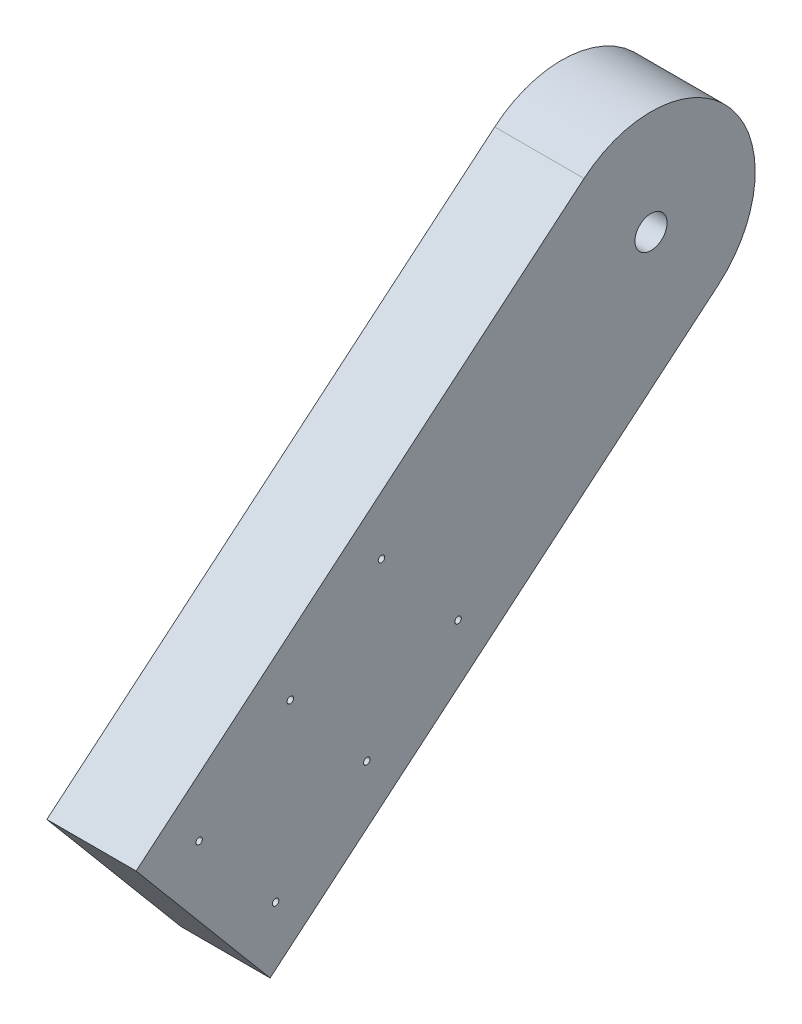
ISO-10303-21;
HEADER;
FILE_DESCRIPTION(('STEP AP214'),'2;1');
FILE_NAME('part.step','',(''),(''),'','','');
FILE_SCHEMA(('AUTOMOTIVE_DESIGN { 1 0 10303 214 1 1 1 1 }'));
ENDSEC;
DATA;
#1=APPLICATION_CONTEXT('core data for automotive mechanical design processes');
#2=APPLICATION_PROTOCOL_DEFINITION('international standard','automotive_design',2000,#1);
#3=PRODUCT_CONTEXT('',#1,'mechanical');
#4=PRODUCT('Part','Part','',(#3));
#5=PRODUCT_RELATED_PRODUCT_CATEGORY('part','',(#4));
#6=PRODUCT_DEFINITION_FORMATION('','',#4);
#7=PRODUCT_DEFINITION_CONTEXT('part definition',#1,'design');
#8=PRODUCT_DEFINITION('design','',#6,#7);
#9=PRODUCT_DEFINITION_SHAPE('','',#8);
#10=(LENGTH_UNIT() NAMED_UNIT(*) SI_UNIT(.MILLI.,.METRE.));
#11=(NAMED_UNIT(*) PLANE_ANGLE_UNIT() SI_UNIT($,.RADIAN.));
#12=(NAMED_UNIT(*) SI_UNIT($,.STERADIAN.) SOLID_ANGLE_UNIT());
#13=UNCERTAINTY_MEASURE_WITH_UNIT(LENGTH_MEASURE(1.E-05),#10,'distance_accuracy_value','');
#14=(GEOMETRIC_REPRESENTATION_CONTEXT(3) GLOBAL_UNCERTAINTY_ASSIGNED_CONTEXT((#13)) GLOBAL_UNIT_ASSIGNED_CONTEXT((#10,
#11,#12)) REPRESENTATION_CONTEXT('',''));
#15=CARTESIAN_POINT('',(0.,0.,0.));
#16=DIRECTION('',(0.,0.,1.));
#17=DIRECTION('',(1.,0.,0.));
#18=AXIS2_PLACEMENT_3D('',#15,#16,#17);
#19=CARTESIAN_POINT('',(95.3770000000001,-243.895191640802,695.878289417359));
#20=DIRECTION('',(-1.,0.,0.));
#21=DIRECTION('',(0.,-1.,0.));
#22=AXIS2_PLACEMENT_3D('',#19,#20,#21);
#23=PLANE('',#22);
#24=CARTESIAN_POINT('',(95.3770000000001,-346.129623296237,778.201155427296));
#25=DIRECTION('',(-1.,0.,0.));
#26=DIRECTION('',(0.,-1.,0.));
#27=AXIS2_PLACEMENT_3D('',#24,#25,#26);
#28=CIRCLE('',#27,1.3890625000001);
#29=CARTESIAN_POINT('',(95.3770000000001,-347.518685796237,778.201155427296));
#30=VERTEX_POINT('',#29);
#31=EDGE_CURVE('E189',#30,#30,#28,.T.);
#32=ORIENTED_EDGE('',*,*,#31,.T.);
#33=EDGE_LOOP('',(#32));
#34=FACE_BOUND('',#33,.T.);
#35=CARTESIAN_POINT('',(95.3770000000001,-378.783233868313,817.116213137741));
#36=DIRECTION('',(-1.,0.,0.));
#37=DIRECTION('',(0.,-1.,0.));
#38=AXIS2_PLACEMENT_3D('',#35,#36,#37);
#39=CIRCLE('',#38,1.3890625000001);
#40=CARTESIAN_POINT('',(95.3770000000001,-380.172296368313,817.116213137741));
#41=VERTEX_POINT('',#40);
#42=EDGE_CURVE('E183',#41,#41,#39,.T.);
#43=ORIENTED_EDGE('',*,*,#42,.T.);
#44=EDGE_LOOP('',(#43));
#45=FACE_BOUND('',#44,.T.);
#46=CARTESIAN_POINT('',(95.3770000000001,-411.43684444039,856.031270848185));
#47=DIRECTION('',(-1.,0.,0.));
#48=DIRECTION('',(0.,-1.,0.));
#49=AXIS2_PLACEMENT_3D('',#46,#47,#48);
#50=CIRCLE('',#49,1.3890625000001);
#51=CARTESIAN_POINT('',(95.3770000000001,-412.82590694039,856.031270848185));
#52=VERTEX_POINT('',#51);
#53=EDGE_CURVE('E177',#52,#52,#50,.T.);
#54=ORIENTED_EDGE('',*,*,#53,.T.);
#55=EDGE_LOOP('',(#54));
#56=FACE_BOUND('',#55,.T.);
#57=CARTESIAN_POINT('',(95.3770000000001,-372.521786729946,888.684881420261));
#58=DIRECTION('',(-1.,0.,0.));
#59=DIRECTION('',(0.,-1.,0.));
#60=AXIS2_PLACEMENT_3D('',#57,#58,#59);
#61=CIRCLE('',#60,1.3890625000001);
#62=CARTESIAN_POINT('',(95.3770000000001,-373.910849229946,888.684881420261));
#63=VERTEX_POINT('',#62);
#64=EDGE_CURVE('E171',#63,#63,#61,.T.);
#65=ORIENTED_EDGE('',*,*,#64,.T.);
#66=EDGE_LOOP('',(#65));
#67=FACE_BOUND('',#66,.T.);
#68=CARTESIAN_POINT('',(95.3770000000001,-339.86817615787,849.769823709817));
#69=DIRECTION('',(-1.,0.,0.));
#70=DIRECTION('',(0.,-1.,0.));
#71=AXIS2_PLACEMENT_3D('',#68,#69,#70);
#72=CIRCLE('',#71,1.3890625000001);
#73=CARTESIAN_POINT('',(95.3770000000001,-341.25723865787,849.769823709817));
#74=VERTEX_POINT('',#73);
#75=EDGE_CURVE('E165',#74,#74,#72,.T.);
#76=ORIENTED_EDGE('',*,*,#75,.T.);
#77=EDGE_LOOP('',(#76));
#78=FACE_BOUND('',#77,.T.);
#79=CARTESIAN_POINT('',(95.3770000000001,-307.214565585793,810.854765999373));
#80=DIRECTION('',(-1.,0.,0.));
#81=DIRECTION('',(0.,-1.,0.));
#82=AXIS2_PLACEMENT_3D('',#79,#80,#81);
#83=CIRCLE('',#82,1.3890625000001);
#84=CARTESIAN_POINT('',(95.3770000000001,-308.603628085793,810.854765999373));
#85=VERTEX_POINT('',#84);
#86=EDGE_CURVE('E159',#85,#85,#83,.T.);
#87=ORIENTED_EDGE('',*,*,#86,.T.);
#88=EDGE_LOOP('',(#87));
#89=FACE_BOUND('',#88,.T.);
#90=DIRECTION('',(0.,-0.766044443118977,-0.642787609686541));
#91=VECTOR('',#90,1.);
#92=CARTESIAN_POINT('',(95.3770000000001,-438.275095046335,858.379313525072));
#93=LINE('',#92,#91);
#94=CARTESIAN_POINT('',(95.3770000000001,-370.173744053058,915.523132026206));
#95=VERTEX_POINT('',#94);
#96=CARTESIAN_POINT('',(95.3770000000001,-438.275095046335,858.379313525072));
#97=VERTEX_POINT('',#96);
#98=EDGE_CURVE('E88',#95,#97,#93,.T.);
#99=ORIENTED_EDGE('',*,*,#98,.T.);
#100=DIRECTION('',(0.,0.642787609686541,-0.766044443118977));
#101=VECTOR('',#100,1.);
#102=CARTESIAN_POINT('',(95.3770000000001,-277.94586713744,667.306380166792));
#103=LINE('',#102,#101);
#104=CARTESIAN_POINT('',(95.3770000000001,-277.94586713744,667.306380166792));
#105=VERTEX_POINT('',#104);
#106=EDGE_CURVE('E83',#97,#105,#103,.T.);
#107=ORIENTED_EDGE('',*,*,#106,.T.);
#108=CARTESIAN_POINT('',(95.3770000000001,-243.895191640802,695.878289417359));
#109=DIRECTION('',(1.,0.,0.));
#110=DIRECTION('',(0.,-1.,0.));
#111=AXIS2_PLACEMENT_3D('',#108,#109,#110);
#112=CIRCLE('',#111,44.4499999999999);
#113=CARTESIAN_POINT('',(95.377,-209.844516144163,724.450198667926));
#114=VERTEX_POINT('',#113);
#115=EDGE_CURVE('E86',#105,#114,#112,.T.);
#116=ORIENTED_EDGE('',*,*,#115,.T.);
#117=DIRECTION('',(0.,-0.64278760968654,0.766044443118977));
#118=VECTOR('',#117,1.);
#119=CARTESIAN_POINT('',(95.3770000000001,-370.173744053058,915.523132026206));
#120=LINE('',#119,#118);
#121=EDGE_CURVE('E53',#114,#95,#120,.T.);
#122=ORIENTED_EDGE('',*,*,#121,.T.);
#123=EDGE_LOOP('',(#99,#107,#116,#122));
#124=FACE_BOUND('',#123,.T.);
#125=CARTESIAN_POINT('',(95.3770000000001,-243.895191640802,695.878289417359));
#126=DIRECTION('',(1.,0.,0.));
#127=DIRECTION('',(0.,1.,0.));
#128=AXIS2_PLACEMENT_3D('',#125,#126,#127);
#129=CIRCLE('',#128,6.84999999999996);
#130=CARTESIAN_POINT('',(95.3770000000001,-250.745191640802,695.878289417359));
#131=VERTEX_POINT('',#130);
#132=EDGE_CURVE('E103',#131,#131,#129,.T.);
#133=ORIENTED_EDGE('',*,*,#132,.F.);
#134=EDGE_LOOP('',(#133));
#135=FACE_BOUND('',#134,.T.);
#136=ADVANCED_FACE('F36',(#34,#45,#56,#67,#78,#89,#124,#135),#23,.F.);
#137=CARTESIAN_POINT('',(57.2770000000001,-243.895191640802,695.878289417359));
#138=DIRECTION('',(-1.,0.,0.));
#139=DIRECTION('',(0.,-1.,0.));
#140=AXIS2_PLACEMENT_3D('',#137,#138,#139);
#141=PLANE('',#140);
#142=CARTESIAN_POINT('',(57.2770000000001,-307.214565585793,810.854765999373));
#143=DIRECTION('',(-1.,0.,0.));
#144=DIRECTION('',(0.,-1.,0.));
#145=AXIS2_PLACEMENT_3D('',#142,#143,#144);
#146=CIRCLE('',#145,1.3890625000001);
#147=CARTESIAN_POINT('',(57.2770000000001,-308.603628085793,810.854765999373));
#148=VERTEX_POINT('',#147);
#149=EDGE_CURVE('E152',#148,#148,#146,.T.);
#150=ORIENTED_EDGE('',*,*,#149,.F.);
#151=EDGE_LOOP('',(#150));
#152=FACE_BOUND('',#151,.T.);
#153=CARTESIAN_POINT('',(57.2770000000001,-346.129623296237,778.201155427296));
#154=DIRECTION('',(-1.,0.,0.));
#155=DIRECTION('',(0.,-1.,0.));
#156=AXIS2_PLACEMENT_3D('',#153,#154,#155);
#157=CIRCLE('',#156,1.3890625000001);
#158=CARTESIAN_POINT('',(57.2770000000001,-347.518685796237,778.201155427296));
#159=VERTEX_POINT('',#158);
#160=EDGE_CURVE('E146',#159,#159,#157,.T.);
#161=ORIENTED_EDGE('',*,*,#160,.F.);
#162=EDGE_LOOP('',(#161));
#163=FACE_BOUND('',#162,.T.);
#164=CARTESIAN_POINT('',(57.2770000000001,-378.783233868313,817.116213137741));
#165=DIRECTION('',(-1.,0.,0.));
#166=DIRECTION('',(0.,-1.,0.));
#167=AXIS2_PLACEMENT_3D('',#164,#165,#166);
#168=CIRCLE('',#167,1.3890625000001);
#169=CARTESIAN_POINT('',(57.2770000000001,-380.172296368313,817.116213137741));
#170=VERTEX_POINT('',#169);
#171=EDGE_CURVE('E140',#170,#170,#168,.T.);
#172=ORIENTED_EDGE('',*,*,#171,.F.);
#173=EDGE_LOOP('',(#172));
#174=FACE_BOUND('',#173,.T.);
#175=CARTESIAN_POINT('',(57.2770000000001,-411.43684444039,856.031270848185));
#176=DIRECTION('',(-1.,0.,0.));
#177=DIRECTION('',(0.,-1.,0.));
#178=AXIS2_PLACEMENT_3D('',#175,#176,#177);
#179=CIRCLE('',#178,1.3890625000001);
#180=CARTESIAN_POINT('',(57.2770000000001,-412.82590694039,856.031270848185));
#181=VERTEX_POINT('',#180);
#182=EDGE_CURVE('E134',#181,#181,#179,.T.);
#183=ORIENTED_EDGE('',*,*,#182,.F.);
#184=EDGE_LOOP('',(#183));
#185=FACE_BOUND('',#184,.T.);
#186=CARTESIAN_POINT('',(57.2770000000001,-372.521786729946,888.684881420261));
#187=DIRECTION('',(-1.,0.,0.));
#188=DIRECTION('',(0.,-1.,0.));
#189=AXIS2_PLACEMENT_3D('',#186,#187,#188);
#190=CIRCLE('',#189,1.3890625000001);
#191=CARTESIAN_POINT('',(57.2770000000001,-373.910849229946,888.684881420261));
#192=VERTEX_POINT('',#191);
#193=EDGE_CURVE('E128',#192,#192,#190,.T.);
#194=ORIENTED_EDGE('',*,*,#193,.F.);
#195=EDGE_LOOP('',(#194));
#196=FACE_BOUND('',#195,.T.);
#197=CARTESIAN_POINT('',(57.2770000000001,-339.86817615787,849.769823709817));
#198=DIRECTION('',(-1.,0.,0.));
#199=DIRECTION('',(0.,-1.,0.));
#200=AXIS2_PLACEMENT_3D('',#197,#198,#199);
#201=CIRCLE('',#200,1.3890625000001);
#202=CARTESIAN_POINT('',(57.2770000000001,-341.25723865787,849.769823709817));
#203=VERTEX_POINT('',#202);
#204=EDGE_CURVE('E121',#203,#203,#201,.T.);
#205=ORIENTED_EDGE('',*,*,#204,.F.);
#206=EDGE_LOOP('',(#205));
#207=FACE_BOUND('',#206,.T.);
#208=DIRECTION('',(0.,-0.766044443118977,-0.642787609686541));
#209=VECTOR('',#208,1.);
#210=CARTESIAN_POINT('',(57.2770000000001,-438.275095046335,858.379313525072));
#211=LINE('',#210,#209);
#212=CARTESIAN_POINT('',(57.2770000000001,-370.173744053058,915.523132026206));
#213=VERTEX_POINT('',#212);
#214=CARTESIAN_POINT('',(57.2770000000001,-438.275095046335,858.379313525072));
#215=VERTEX_POINT('',#214);
#216=EDGE_CURVE('E100',#213,#215,#211,.T.);
#217=ORIENTED_EDGE('',*,*,#216,.F.);
#218=DIRECTION('',(0.,-0.64278760968654,0.766044443118977));
#219=VECTOR('',#218,1.);
#220=CARTESIAN_POINT('',(57.2770000000001,-370.173744053058,915.523132026206));
#221=LINE('',#220,#219);
#222=CARTESIAN_POINT('',(57.2770000000001,-209.844516144163,724.450198667926));
#223=VERTEX_POINT('',#222);
#224=EDGE_CURVE('E76',#223,#213,#221,.T.);
#225=ORIENTED_EDGE('',*,*,#224,.F.);
#226=CARTESIAN_POINT('',(57.2770000000001,-243.895191640802,695.878289417359));
#227=DIRECTION('',(1.,0.,0.));
#228=DIRECTION('',(0.,-1.,0.));
#229=AXIS2_PLACEMENT_3D('',#226,#227,#228);
#230=CIRCLE('',#229,44.4499999999999);
#231=CARTESIAN_POINT('',(57.2770000000001,-277.94586713744,667.306380166792));
#232=VERTEX_POINT('',#231);
#233=EDGE_CURVE('E70',#232,#223,#230,.T.);
#234=ORIENTED_EDGE('',*,*,#233,.F.);
#235=DIRECTION('',(0.,0.642787609686541,-0.766044443118977));
#236=VECTOR('',#235,1.);
#237=CARTESIAN_POINT('',(57.2770000000001,-277.94586713744,667.306380166792));
#238=LINE('',#237,#236);
#239=EDGE_CURVE('E92',#215,#232,#238,.T.);
#240=ORIENTED_EDGE('',*,*,#239,.F.);
#241=EDGE_LOOP('',(#217,#225,#234,#240));
#242=FACE_BOUND('',#241,.T.);
#243=CARTESIAN_POINT('',(57.2770000000001,-243.895191640802,695.878289417359));
#244=DIRECTION('',(1.,0.,0.));
#245=DIRECTION('',(0.,1.,0.));
#246=AXIS2_PLACEMENT_3D('',#243,#244,#245);
#247=CIRCLE('',#246,6.84999999999996);
#248=CARTESIAN_POINT('',(57.2770000000001,-250.745191640802,695.878289417359));
#249=VERTEX_POINT('',#248);
#250=EDGE_CURVE('E115',#249,#249,#247,.T.);
#251=ORIENTED_EDGE('',*,*,#250,.T.);
#252=EDGE_LOOP('',(#251));
#253=FACE_BOUND('',#252,.T.);
#254=ADVANCED_FACE('F111',(#152,#163,#174,#185,#196,#207,#242,#253),#141,.T.);
#255=CARTESIAN_POINT('',(95.3770000000001,-438.275095046335,858.379313525072));
#256=DIRECTION('',(0.,0.642787609686541,-0.766044443118977));
#257=DIRECTION('',(0.,0.766044443118977,0.642787609686541));
#258=AXIS2_PLACEMENT_3D('',#255,#256,#257);
#259=PLANE('',#258);
#260=ORIENTED_EDGE('',*,*,#216,.T.);
#261=DIRECTION('',(-1.,0.,0.));
#262=VECTOR('',#261,1.);
#263=CARTESIAN_POINT('',(95.3770000000001,-438.275095046335,858.379313525072));
#264=LINE('',#263,#262);
#265=EDGE_CURVE('E11',#97,#215,#264,.T.);
#266=ORIENTED_EDGE('',*,*,#265,.F.);
#267=ORIENTED_EDGE('',*,*,#98,.F.);
#268=DIRECTION('',(-1.,0.,0.));
#269=VECTOR('',#268,1.);
#270=CARTESIAN_POINT('',(95.3770000000001,-370.173744053058,915.523132026206));
#271=LINE('',#270,#269);
#272=EDGE_CURVE('E96',#95,#213,#271,.T.);
#273=ORIENTED_EDGE('',*,*,#272,.T.);
#274=EDGE_LOOP('',(#260,#266,#267,#273));
#275=FACE_BOUND('',#274,.T.);
#276=ADVANCED_FACE('F38',(#275),#259,.F.);
#277=CARTESIAN_POINT('',(95.3770000000001,-277.94586713744,667.306380166792));
#278=DIRECTION('',(0.,0.766044443118977,0.642787609686541));
#279=DIRECTION('',(0.,-0.642787609686541,0.766044443118977));
#280=AXIS2_PLACEMENT_3D('',#277,#278,#279);
#281=PLANE('',#280);
#282=ORIENTED_EDGE('',*,*,#239,.T.);
#283=DIRECTION('',(-1.,0.,0.));
#284=VECTOR('',#283,1.);
#285=CARTESIAN_POINT('',(95.3770000000001,-277.94586713744,667.306380166792));
#286=LINE('',#285,#284);
#287=EDGE_CURVE('E45',#105,#232,#286,.T.);
#288=ORIENTED_EDGE('',*,*,#287,.F.);
#289=ORIENTED_EDGE('',*,*,#106,.F.);
#290=ORIENTED_EDGE('',*,*,#265,.T.);
#291=EDGE_LOOP('',(#282,#288,#289,#290));
#292=FACE_BOUND('',#291,.T.);
#293=ADVANCED_FACE('F91',(#292),#281,.F.);
#294=CARTESIAN_POINT('',(95.3770000000001,-243.895191640802,695.878289417359));
#295=DIRECTION('',(-1.,0.,0.));
#296=DIRECTION('',(0.,-1.,0.));
#297=AXIS2_PLACEMENT_3D('',#294,#295,#296);
#298=CYLINDRICAL_SURFACE('',#297,44.4499999999999);
#299=ORIENTED_EDGE('',*,*,#233,.T.);
#300=DIRECTION('',(-1.,0.,0.));
#301=VECTOR('',#300,1.);
#302=CARTESIAN_POINT('',(95.377,-209.844516144163,724.450198667926));
#303=LINE('',#302,#301);
#304=EDGE_CURVE('E93',#114,#223,#303,.T.);
#305=ORIENTED_EDGE('',*,*,#304,.F.);
#306=ORIENTED_EDGE('',*,*,#115,.F.);
#307=ORIENTED_EDGE('',*,*,#287,.T.);
#308=EDGE_LOOP('',(#299,#305,#306,#307));
#309=FACE_BOUND('',#308,.T.);
#310=ADVANCED_FACE('F94',(#309),#298,.T.);
#311=CARTESIAN_POINT('',(95.3770000000001,-370.173744053058,915.523132026206));
#312=DIRECTION('',(0.,-0.766044443118977,-0.64278760968654));
#313=DIRECTION('',(0.,0.64278760968654,-0.766044443118977));
#314=AXIS2_PLACEMENT_3D('',#311,#312,#313);
#315=PLANE('',#314);
#316=ORIENTED_EDGE('',*,*,#224,.T.);
#317=ORIENTED_EDGE('',*,*,#272,.F.);
#318=ORIENTED_EDGE('',*,*,#121,.F.);
#319=ORIENTED_EDGE('',*,*,#304,.T.);
#320=EDGE_LOOP('',(#316,#317,#318,#319));
#321=FACE_BOUND('',#320,.T.);
#322=ADVANCED_FACE('F108',(#321),#315,.F.);
#323=CARTESIAN_POINT('',(95.3770000000001,-243.895191640802,695.878289417359));
#324=DIRECTION('',(-1.,0.,0.));
#325=DIRECTION('',(0.,-1.,0.));
#326=AXIS2_PLACEMENT_3D('',#323,#324,#325);
#327=CYLINDRICAL_SURFACE('',#326,6.84999999999996);
#328=CARTESIAN_POINT('',(95.3770000000001,-250.745191640802,695.878289417359));
#329=CARTESIAN_POINT('',(94.9801250000001,-250.745191640802,695.878289417359));
#330=CARTESIAN_POINT('',(94.5832500000001,-250.745191640802,695.878289417359));
#331=CARTESIAN_POINT('',(93.7895000000001,-250.745191640802,695.878289417359));
#332=CARTESIAN_POINT('',(93.3926250000001,-250.745191640802,695.878289417359));
#333=CARTESIAN_POINT('',(92.5988750000001,-250.745191640802,695.878289417359));
#334=CARTESIAN_POINT('',(92.2020000000001,-250.745191640802,695.878289417359));
#335=CARTESIAN_POINT('',(91.4082500000001,-250.745191640802,695.878289417359));
#336=CARTESIAN_POINT('',(91.0113750000001,-250.745191640802,695.878289417359));
#337=CARTESIAN_POINT('',(90.2176250000001,-250.745191640802,695.878289417359));
#338=CARTESIAN_POINT('',(89.8207500000001,-250.745191640802,695.878289417359));
#339=CARTESIAN_POINT('',(89.0270000000001,-250.745191640802,695.878289417359));
#340=CARTESIAN_POINT('',(88.6301250000001,-250.745191640802,695.878289417359));
#341=CARTESIAN_POINT('',(87.8363750000001,-250.745191640802,695.878289417359));
#342=CARTESIAN_POINT('',(87.4395000000001,-250.745191640802,695.878289417359));
#343=CARTESIAN_POINT('',(86.6457500000001,-250.745191640802,695.878289417359));
#344=CARTESIAN_POINT('',(86.2488750000001,-250.745191640802,695.878289417359));
#345=CARTESIAN_POINT('',(85.4551250000001,-250.745191640802,695.878289417359));
#346=CARTESIAN_POINT('',(85.0582500000001,-250.745191640802,695.878289417359));
#347=CARTESIAN_POINT('',(84.2645000000001,-250.745191640802,695.878289417359));
#348=CARTESIAN_POINT('',(83.8676250000001,-250.745191640802,695.878289417359));
#349=CARTESIAN_POINT('',(83.0738750000001,-250.745191640802,695.878289417359));
#350=CARTESIAN_POINT('',(82.6770000000001,-250.745191640802,695.878289417359));
#351=CARTESIAN_POINT('',(81.8832500000001,-250.745191640802,695.878289417359));
#352=CARTESIAN_POINT('',(81.4863750000001,-250.745191640802,695.878289417359));
#353=CARTESIAN_POINT('',(80.6926250000001,-250.745191640802,695.878289417359));
#354=CARTESIAN_POINT('',(80.2957500000001,-250.745191640802,695.878289417359));
#355=CARTESIAN_POINT('',(79.5020000000001,-250.745191640802,695.878289417359));
#356=CARTESIAN_POINT('',(79.1051250000001,-250.745191640802,695.878289417359));
#357=CARTESIAN_POINT('',(78.3113750000001,-250.745191640802,695.878289417359));
#358=CARTESIAN_POINT('',(77.9145000000001,-250.745191640802,695.878289417359));
#359=CARTESIAN_POINT('',(77.1207500000001,-250.745191640802,695.878289417359));
#360=CARTESIAN_POINT('',(76.7238750000001,-250.745191640802,695.878289417359));
#361=CARTESIAN_POINT('',(75.9301250000001,-250.745191640802,695.878289417359));
#362=CARTESIAN_POINT('',(75.5332500000001,-250.745191640802,695.878289417359));
#363=CARTESIAN_POINT('',(74.7395,-250.745191640802,695.878289417359));
#364=CARTESIAN_POINT('',(74.3426250000001,-250.745191640802,695.878289417359));
#365=CARTESIAN_POINT('',(73.5488750000001,-250.745191640802,695.878289417359));
#366=CARTESIAN_POINT('',(73.1520000000001,-250.745191640802,695.878289417359));
#367=CARTESIAN_POINT('',(72.3582500000001,-250.745191640802,695.878289417359));
#368=CARTESIAN_POINT('',(71.9613750000001,-250.745191640802,695.878289417359));
#369=CARTESIAN_POINT('',(71.1676250000001,-250.745191640802,695.878289417359));
#370=CARTESIAN_POINT('',(70.7707500000001,-250.745191640802,695.878289417359));
#371=CARTESIAN_POINT('',(69.977,-250.745191640802,695.878289417359));
#372=CARTESIAN_POINT('',(69.5801250000001,-250.745191640802,695.878289417359));
#373=CARTESIAN_POINT('',(68.786375,-250.745191640802,695.878289417359));
#374=CARTESIAN_POINT('',(68.3895000000001,-250.745191640802,695.878289417359));
#375=CARTESIAN_POINT('',(67.5957500000001,-250.745191640802,695.878289417359));
#376=CARTESIAN_POINT('',(67.1988750000001,-250.745191640802,695.878289417359));
#377=CARTESIAN_POINT('',(66.4051250000001,-250.745191640802,695.878289417359));
#378=CARTESIAN_POINT('',(66.0082500000001,-250.745191640802,695.878289417359));
#379=CARTESIAN_POINT('',(65.2145,-250.745191640802,695.878289417359));
#380=CARTESIAN_POINT('',(64.8176250000001,-250.745191640802,695.878289417359));
#381=CARTESIAN_POINT('',(64.023875,-250.745191640802,695.878289417359));
#382=CARTESIAN_POINT('',(63.6270000000001,-250.745191640802,695.878289417359));
#383=CARTESIAN_POINT('',(62.8332500000001,-250.745191640802,695.878289417359));
#384=CARTESIAN_POINT('',(62.4363750000001,-250.745191640802,695.878289417359));
#385=CARTESIAN_POINT('',(61.6426250000001,-250.745191640802,695.878289417359));
#386=CARTESIAN_POINT('',(61.2457500000001,-250.745191640802,695.878289417359));
#387=CARTESIAN_POINT('',(60.4520000000001,-250.745191640802,695.878289417359));
#388=CARTESIAN_POINT('',(60.0551250000001,-250.745191640802,695.878289417359));
#389=CARTESIAN_POINT('',(59.2613750000001,-250.745191640802,695.878289417359));
#390=CARTESIAN_POINT('',(58.8645000000001,-250.745191640802,695.878289417359));
#391=CARTESIAN_POINT('',(58.0707500000001,-250.745191640802,695.878289417359));
#392=CARTESIAN_POINT('',(57.6738750000001,-250.745191640802,695.878289417359));
#393=CARTESIAN_POINT('',(57.2770000000001,-250.745191640802,695.878289417359));
#394=B_SPLINE_CURVE_WITH_KNOTS('',3,(#328,#329,#330,#331,#332,#333,#334,#335,#336,#337,#338,
#339,#340,#341,#342,#343,#344,#345,#346,#347,#348,#349,#350,#351,#352,#353,#354,#355,#356,#357,
#358,#359,#360,#361,#362,#363,#364,#365,#366,#367,#368,#369,#370,#371,#372,#373,#374,#375,#376,
#377,#378,#379,#380,#381,#382,#383,#384,#385,#386,#387,#388,#389,#390,#391,#392,#393),
.UNSPECIFIED.,.F.,.F.,(4,2,2,2,2,2,2,2,2,2,2,2,2,2,2,2,2,2,2,2,2,2,2,2,2,2,2,2,2,2,2,2,4),(0.,
1.19062499999999,2.38124999999999,3.57187499999999,4.76249999999999,5.95312499999999,
7.14374999999999,8.33437499999999,9.52499999999999,10.715625,11.90625,13.096875,14.2875,
15.478125,16.66875,17.859375,19.05,20.240625,21.43125,22.621875,23.8125,25.003125,26.19375,
27.384375,28.575,29.765625,30.95625,32.146875,33.3375,34.528125,35.71875,36.909375,38.1),.UNSPECIFIED.);
#395=EDGE_CURVE('BSEAM218',#131,#249,#394,.T.);
#396=ORIENTED_EDGE('',*,*,#132,.T.);
#397=ORIENTED_EDGE('',*,*,#250,.F.);
#398=ORIENTED_EDGE('',*,*,#395,.T.);
#399=ORIENTED_EDGE('',*,*,#395,.F.);
#400=EDGE_LOOP('',(#396,#398,#397,#399));
#401=FACE_BOUND('',#400,.T.);
#402=ADVANCED_FACE('F218',(#401),#327,.F.);
#403=CARTESIAN_POINT('',(69.9770000000001,-339.86817615787,849.769823709817));
#404=DIRECTION('',(-1.,0.,0.));
#405=DIRECTION('',(0.,-1.,0.));
#406=AXIS2_PLACEMENT_3D('',#403,#404,#405);
#407=CYLINDRICAL_SURFACE('',#406,1.3890625000001);
#408=CARTESIAN_POINT('',(69.9770000000001,-339.86817615787,849.769823709817));
#409=DIRECTION('',(-1.,0.,0.));
#410=DIRECTION('',(0.,-1.,0.));
#411=AXIS2_PLACEMENT_3D('',#408,#409,#410);
#412=CIRCLE('',#411,1.3890625000001);
#413=CARTESIAN_POINT('',(69.9770000000001,-341.25723865787,849.769823709817));
#414=VERTEX_POINT('',#413);
#415=EDGE_CURVE('E124',#414,#414,#412,.T.);
#416=ORIENTED_EDGE('',*,*,#415,.F.);
#417=EDGE_LOOP('',(#416));
#418=FACE_BOUND('',#417,.T.);
#419=ORIENTED_EDGE('',*,*,#204,.T.);
#420=EDGE_LOOP('',(#419));
#421=FACE_BOUND('',#420,.T.);
#422=ADVANCED_FACE('F456',(#418,#421),#407,.F.);
#423=CARTESIAN_POINT('',(69.9770000000001,-339.86817615787,849.769823709817));
#424=DIRECTION('',(-1.,0.,0.));
#425=DIRECTION('',(0.,-1.,0.));
#426=AXIS2_PLACEMENT_3D('',#423,#424,#425);
#427=PLANE('',#426);
#428=ORIENTED_EDGE('',*,*,#415,.T.);
#429=EDGE_LOOP('',(#428));
#430=FACE_BOUND('',#429,.T.);
#431=ADVANCED_FACE('F446',(#430),#427,.T.);
#432=CARTESIAN_POINT('',(69.9770000000001,-372.521786729946,888.684881420261));
#433=DIRECTION('',(-1.,0.,0.));
#434=DIRECTION('',(0.,-1.,0.));
#435=AXIS2_PLACEMENT_3D('',#432,#433,#434);
#436=CYLINDRICAL_SURFACE('',#435,1.3890625000001);
#437=CARTESIAN_POINT('',(69.9770000000001,-372.521786729946,888.684881420261));
#438=DIRECTION('',(-1.,0.,0.));
#439=DIRECTION('',(0.,-1.,0.));
#440=AXIS2_PLACEMENT_3D('',#437,#438,#439);
#441=CIRCLE('',#440,1.3890625000001);
#442=CARTESIAN_POINT('',(69.9770000000001,-373.910849229946,888.684881420261));
#443=VERTEX_POINT('',#442);
#444=EDGE_CURVE('E131',#443,#443,#441,.T.);
#445=ORIENTED_EDGE('',*,*,#444,.F.);
#446=EDGE_LOOP('',(#445));
#447=FACE_BOUND('',#446,.T.);
#448=ORIENTED_EDGE('',*,*,#193,.T.);
#449=EDGE_LOOP('',(#448));
#450=FACE_BOUND('',#449,.T.);
#451=ADVANCED_FACE('F436',(#447,#450),#436,.F.);
#452=CARTESIAN_POINT('',(69.9770000000001,-372.521786729946,888.684881420261));
#453=DIRECTION('',(-1.,0.,0.));
#454=DIRECTION('',(0.,-1.,0.));
#455=AXIS2_PLACEMENT_3D('',#452,#453,#454);
#456=PLANE('',#455);
#457=ORIENTED_EDGE('',*,*,#444,.T.);
#458=EDGE_LOOP('',(#457));
#459=FACE_BOUND('',#458,.T.);
#460=ADVANCED_FACE('F426',(#459),#456,.T.);
#461=CARTESIAN_POINT('',(69.9770000000001,-411.43684444039,856.031270848185));
#462=DIRECTION('',(-1.,0.,0.));
#463=DIRECTION('',(0.,-1.,0.));
#464=AXIS2_PLACEMENT_3D('',#461,#462,#463);
#465=CYLINDRICAL_SURFACE('',#464,1.3890625000001);
#466=CARTESIAN_POINT('',(69.9770000000001,-411.43684444039,856.031270848185));
#467=DIRECTION('',(-1.,0.,0.));
#468=DIRECTION('',(0.,-1.,0.));
#469=AXIS2_PLACEMENT_3D('',#466,#467,#468);
#470=CIRCLE('',#469,1.3890625000001);
#471=CARTESIAN_POINT('',(69.9770000000001,-412.82590694039,856.031270848185));
#472=VERTEX_POINT('',#471);
#473=EDGE_CURVE('E137',#472,#472,#470,.T.);
#474=ORIENTED_EDGE('',*,*,#473,.F.);
#475=EDGE_LOOP('',(#474));
#476=FACE_BOUND('',#475,.T.);
#477=ORIENTED_EDGE('',*,*,#182,.T.);
#478=EDGE_LOOP('',(#477));
#479=FACE_BOUND('',#478,.T.);
#480=ADVANCED_FACE('F416',(#476,#479),#465,.F.);
#481=CARTESIAN_POINT('',(69.9770000000001,-411.43684444039,856.031270848185));
#482=DIRECTION('',(-1.,0.,0.));
#483=DIRECTION('',(0.,-1.,0.));
#484=AXIS2_PLACEMENT_3D('',#481,#482,#483);
#485=PLANE('',#484);
#486=ORIENTED_EDGE('',*,*,#473,.T.);
#487=EDGE_LOOP('',(#486));
#488=FACE_BOUND('',#487,.T.);
#489=ADVANCED_FACE('F406',(#488),#485,.T.);
#490=CARTESIAN_POINT('',(69.9770000000001,-378.783233868313,817.116213137741));
#491=DIRECTION('',(-1.,0.,0.));
#492=DIRECTION('',(0.,-1.,0.));
#493=AXIS2_PLACEMENT_3D('',#490,#491,#492);
#494=CYLINDRICAL_SURFACE('',#493,1.3890625000001);
#495=CARTESIAN_POINT('',(69.9770000000001,-378.783233868313,817.116213137741));
#496=DIRECTION('',(-1.,0.,0.));
#497=DIRECTION('',(0.,-1.,0.));
#498=AXIS2_PLACEMENT_3D('',#495,#496,#497);
#499=CIRCLE('',#498,1.3890625000001);
#500=CARTESIAN_POINT('',(69.9770000000001,-380.172296368313,817.116213137741));
#501=VERTEX_POINT('',#500);
#502=EDGE_CURVE('E143',#501,#501,#499,.T.);
#503=ORIENTED_EDGE('',*,*,#502,.F.);
#504=EDGE_LOOP('',(#503));
#505=FACE_BOUND('',#504,.T.);
#506=ORIENTED_EDGE('',*,*,#171,.T.);
#507=EDGE_LOOP('',(#506));
#508=FACE_BOUND('',#507,.T.);
#509=ADVANCED_FACE('F396',(#505,#508),#494,.F.);
#510=CARTESIAN_POINT('',(69.9770000000001,-378.783233868313,817.116213137741));
#511=DIRECTION('',(-1.,0.,0.));
#512=DIRECTION('',(0.,-1.,0.));
#513=AXIS2_PLACEMENT_3D('',#510,#511,#512);
#514=PLANE('',#513);
#515=ORIENTED_EDGE('',*,*,#502,.T.);
#516=EDGE_LOOP('',(#515));
#517=FACE_BOUND('',#516,.T.);
#518=ADVANCED_FACE('F386',(#517),#514,.T.);
#519=CARTESIAN_POINT('',(69.9770000000001,-346.129623296237,778.201155427296));
#520=DIRECTION('',(-1.,0.,0.));
#521=DIRECTION('',(0.,-1.,0.));
#522=AXIS2_PLACEMENT_3D('',#519,#520,#521);
#523=CYLINDRICAL_SURFACE('',#522,1.3890625000001);
#524=CARTESIAN_POINT('',(69.9770000000001,-346.129623296237,778.201155427296));
#525=DIRECTION('',(-1.,0.,0.));
#526=DIRECTION('',(0.,-1.,0.));
#527=AXIS2_PLACEMENT_3D('',#524,#525,#526);
#528=CIRCLE('',#527,1.3890625000001);
#529=CARTESIAN_POINT('',(69.9770000000001,-347.518685796237,778.201155427296));
#530=VERTEX_POINT('',#529);
#531=EDGE_CURVE('E149',#530,#530,#528,.T.);
#532=ORIENTED_EDGE('',*,*,#531,.F.);
#533=EDGE_LOOP('',(#532));
#534=FACE_BOUND('',#533,.T.);
#535=ORIENTED_EDGE('',*,*,#160,.T.);
#536=EDGE_LOOP('',(#535));
#537=FACE_BOUND('',#536,.T.);
#538=ADVANCED_FACE('F376',(#534,#537),#523,.F.);
#539=CARTESIAN_POINT('',(69.9770000000001,-346.129623296237,778.201155427296));
#540=DIRECTION('',(-1.,0.,0.));
#541=DIRECTION('',(0.,-1.,0.));
#542=AXIS2_PLACEMENT_3D('',#539,#540,#541);
#543=PLANE('',#542);
#544=ORIENTED_EDGE('',*,*,#531,.T.);
#545=EDGE_LOOP('',(#544));
#546=FACE_BOUND('',#545,.T.);
#547=ADVANCED_FACE('F366',(#546),#543,.T.);
#548=CARTESIAN_POINT('',(69.9770000000001,-307.214565585793,810.854765999373));
#549=DIRECTION('',(-1.,0.,0.));
#550=DIRECTION('',(0.,-1.,0.));
#551=AXIS2_PLACEMENT_3D('',#548,#549,#550);
#552=CYLINDRICAL_SURFACE('',#551,1.3890625000001);
#553=CARTESIAN_POINT('',(69.9770000000001,-307.214565585793,810.854765999373));
#554=DIRECTION('',(-1.,0.,0.));
#555=DIRECTION('',(0.,-1.,0.));
#556=AXIS2_PLACEMENT_3D('',#553,#554,#555);
#557=CIRCLE('',#556,1.3890625000001);
#558=CARTESIAN_POINT('',(69.9770000000001,-308.603628085793,810.854765999373));
#559=VERTEX_POINT('',#558);
#560=EDGE_CURVE('E118',#559,#559,#557,.T.);
#561=ORIENTED_EDGE('',*,*,#560,.F.);
#562=EDGE_LOOP('',(#561));
#563=FACE_BOUND('',#562,.T.);
#564=ORIENTED_EDGE('',*,*,#149,.T.);
#565=EDGE_LOOP('',(#564));
#566=FACE_BOUND('',#565,.T.);
#567=ADVANCED_FACE('F356',(#563,#566),#552,.F.);
#568=CARTESIAN_POINT('',(69.9770000000001,-307.214565585793,810.854765999373));
#569=DIRECTION('',(-1.,0.,0.));
#570=DIRECTION('',(0.,-1.,0.));
#571=AXIS2_PLACEMENT_3D('',#568,#569,#570);
#572=PLANE('',#571);
#573=ORIENTED_EDGE('',*,*,#560,.T.);
#574=EDGE_LOOP('',(#573));
#575=FACE_BOUND('',#574,.T.);
#576=ADVANCED_FACE('F346',(#575),#572,.T.);
#577=CARTESIAN_POINT('',(82.6770000000001,-307.214565585793,810.854765999373));
#578=DIRECTION('',(1.,0.,0.));
#579=DIRECTION('',(0.,-1.,0.));
#580=AXIS2_PLACEMENT_3D('',#577,#578,#579);
#581=CYLINDRICAL_SURFACE('',#580,1.3890625000001);
#582=CARTESIAN_POINT('',(82.6770000000001,-307.214565585793,810.854765999373));
#583=DIRECTION('',(-1.,0.,0.));
#584=DIRECTION('',(0.,-1.,0.));
#585=AXIS2_PLACEMENT_3D('',#582,#583,#584);
#586=CIRCLE('',#585,1.3890625000001);
#587=CARTESIAN_POINT('',(82.6770000000001,-308.603628085793,810.854765999373));
#588=VERTEX_POINT('',#587);
#589=EDGE_CURVE('E125',#588,#588,#586,.T.);
#590=ORIENTED_EDGE('',*,*,#589,.T.);
#591=EDGE_LOOP('',(#590));
#592=FACE_BOUND('',#591,.T.);
#593=ORIENTED_EDGE('',*,*,#86,.F.);
#594=EDGE_LOOP('',(#593));
#595=FACE_BOUND('',#594,.T.);
#596=ADVANCED_FACE('F336',(#592,#595),#581,.F.);
#597=CARTESIAN_POINT('',(82.6770000000001,-307.214565585793,810.854765999373));
#598=DIRECTION('',(1.,0.,0.));
#599=DIRECTION('',(0.,-1.,0.));
#600=AXIS2_PLACEMENT_3D('',#597,#598,#599);
#601=PLANE('',#600);
#602=ORIENTED_EDGE('',*,*,#589,.F.);
#603=EDGE_LOOP('',(#602));
#604=FACE_BOUND('',#603,.T.);
#605=ADVANCED_FACE('F326',(#604),#601,.T.);
#606=CARTESIAN_POINT('',(82.6770000000001,-339.86817615787,849.769823709817));
#607=DIRECTION('',(1.,0.,0.));
#608=DIRECTION('',(0.,-1.,0.));
#609=AXIS2_PLACEMENT_3D('',#606,#607,#608);
#610=CYLINDRICAL_SURFACE('',#609,1.3890625000001);
#611=CARTESIAN_POINT('',(82.6770000000001,-339.86817615787,849.769823709817));
#612=DIRECTION('',(-1.,0.,0.));
#613=DIRECTION('',(0.,-1.,0.));
#614=AXIS2_PLACEMENT_3D('',#611,#612,#613);
#615=CIRCLE('',#614,1.3890625000001);
#616=CARTESIAN_POINT('',(82.6770000000001,-341.25723865787,849.769823709817));
#617=VERTEX_POINT('',#616);
#618=EDGE_CURVE('E162',#617,#617,#615,.T.);
#619=ORIENTED_EDGE('',*,*,#618,.T.);
#620=EDGE_LOOP('',(#619));
#621=FACE_BOUND('',#620,.T.);
#622=ORIENTED_EDGE('',*,*,#75,.F.);
#623=EDGE_LOOP('',(#622));
#624=FACE_BOUND('',#623,.T.);
#625=ADVANCED_FACE('F316',(#621,#624),#610,.F.);
#626=CARTESIAN_POINT('',(82.6770000000001,-339.86817615787,849.769823709817));
#627=DIRECTION('',(1.,0.,0.));
#628=DIRECTION('',(0.,-1.,0.));
#629=AXIS2_PLACEMENT_3D('',#626,#627,#628);
#630=PLANE('',#629);
#631=ORIENTED_EDGE('',*,*,#618,.F.);
#632=EDGE_LOOP('',(#631));
#633=FACE_BOUND('',#632,.T.);
#634=ADVANCED_FACE('F306',(#633),#630,.T.);
#635=CARTESIAN_POINT('',(82.6770000000001,-372.521786729946,888.684881420261));
#636=DIRECTION('',(1.,0.,0.));
#637=DIRECTION('',(0.,-1.,0.));
#638=AXIS2_PLACEMENT_3D('',#635,#636,#637);
#639=CYLINDRICAL_SURFACE('',#638,1.3890625000001);
#640=CARTESIAN_POINT('',(82.6770000000001,-372.521786729946,888.684881420261));
#641=DIRECTION('',(-1.,0.,0.));
#642=DIRECTION('',(0.,-1.,0.));
#643=AXIS2_PLACEMENT_3D('',#640,#641,#642);
#644=CIRCLE('',#643,1.3890625000001);
#645=CARTESIAN_POINT('',(82.6770000000001,-373.910849229946,888.684881420261));
#646=VERTEX_POINT('',#645);
#647=EDGE_CURVE('E168',#646,#646,#644,.T.);
#648=ORIENTED_EDGE('',*,*,#647,.T.);
#649=EDGE_LOOP('',(#648));
#650=FACE_BOUND('',#649,.T.);
#651=ORIENTED_EDGE('',*,*,#64,.F.);
#652=EDGE_LOOP('',(#651));
#653=FACE_BOUND('',#652,.T.);
#654=ADVANCED_FACE('F296',(#650,#653),#639,.F.);
#655=CARTESIAN_POINT('',(82.6770000000001,-372.521786729946,888.684881420261));
#656=DIRECTION('',(1.,0.,0.));
#657=DIRECTION('',(0.,-1.,0.));
#658=AXIS2_PLACEMENT_3D('',#655,#656,#657);
#659=PLANE('',#658);
#660=ORIENTED_EDGE('',*,*,#647,.F.);
#661=EDGE_LOOP('',(#660));
#662=FACE_BOUND('',#661,.T.);
#663=ADVANCED_FACE('F286',(#662),#659,.T.);
#664=CARTESIAN_POINT('',(82.6770000000001,-411.43684444039,856.031270848185));
#665=DIRECTION('',(1.,0.,0.));
#666=DIRECTION('',(0.,-1.,0.));
#667=AXIS2_PLACEMENT_3D('',#664,#665,#666);
#668=CYLINDRICAL_SURFACE('',#667,1.3890625000001);
#669=CARTESIAN_POINT('',(82.6770000000001,-411.43684444039,856.031270848185));
#670=DIRECTION('',(-1.,0.,0.));
#671=DIRECTION('',(0.,-1.,0.));
#672=AXIS2_PLACEMENT_3D('',#669,#670,#671);
#673=CIRCLE('',#672,1.3890625000001);
#674=CARTESIAN_POINT('',(82.6770000000001,-412.82590694039,856.031270848185));
#675=VERTEX_POINT('',#674);
#676=EDGE_CURVE('E174',#675,#675,#673,.T.);
#677=ORIENTED_EDGE('',*,*,#676,.T.);
#678=EDGE_LOOP('',(#677));
#679=FACE_BOUND('',#678,.T.);
#680=ORIENTED_EDGE('',*,*,#53,.F.);
#681=EDGE_LOOP('',(#680));
#682=FACE_BOUND('',#681,.T.);
#683=ADVANCED_FACE('F276',(#679,#682),#668,.F.);
#684=CARTESIAN_POINT('',(82.6770000000001,-411.43684444039,856.031270848185));
#685=DIRECTION('',(1.,0.,0.));
#686=DIRECTION('',(0.,-1.,0.));
#687=AXIS2_PLACEMENT_3D('',#684,#685,#686);
#688=PLANE('',#687);
#689=ORIENTED_EDGE('',*,*,#676,.F.);
#690=EDGE_LOOP('',(#689));
#691=FACE_BOUND('',#690,.T.);
#692=ADVANCED_FACE('F266',(#691),#688,.T.);
#693=CARTESIAN_POINT('',(82.6770000000001,-378.783233868313,817.116213137741));
#694=DIRECTION('',(1.,0.,0.));
#695=DIRECTION('',(0.,-1.,0.));
#696=AXIS2_PLACEMENT_3D('',#693,#694,#695);
#697=CYLINDRICAL_SURFACE('',#696,1.3890625000001);
#698=CARTESIAN_POINT('',(82.6770000000001,-378.783233868313,817.116213137741));
#699=DIRECTION('',(-1.,0.,0.));
#700=DIRECTION('',(0.,-1.,0.));
#701=AXIS2_PLACEMENT_3D('',#698,#699,#700);
#702=CIRCLE('',#701,1.3890625000001);
#703=CARTESIAN_POINT('',(82.6770000000001,-380.172296368313,817.116213137741));
#704=VERTEX_POINT('',#703);
#705=EDGE_CURVE('E180',#704,#704,#702,.T.);
#706=ORIENTED_EDGE('',*,*,#705,.T.);
#707=EDGE_LOOP('',(#706));
#708=FACE_BOUND('',#707,.T.);
#709=ORIENTED_EDGE('',*,*,#42,.F.);
#710=EDGE_LOOP('',(#709));
#711=FACE_BOUND('',#710,.T.);
#712=ADVANCED_FACE('F207',(#708,#711),#697,.F.);
#713=CARTESIAN_POINT('',(82.6770000000001,-378.783233868313,817.116213137741));
#714=DIRECTION('',(1.,0.,0.));
#715=DIRECTION('',(0.,-1.,0.));
#716=AXIS2_PLACEMENT_3D('',#713,#714,#715);
#717=PLANE('',#716);
#718=ORIENTED_EDGE('',*,*,#705,.F.);
#719=EDGE_LOOP('',(#718));
#720=FACE_BOUND('',#719,.T.);
#721=ADVANCED_FACE('F198',(#720),#717,.T.);
#722=CARTESIAN_POINT('',(82.6770000000001,-346.129623296237,778.201155427296));
#723=DIRECTION('',(1.,0.,0.));
#724=DIRECTION('',(0.,-1.,0.));
#725=AXIS2_PLACEMENT_3D('',#722,#723,#724);
#726=CYLINDRICAL_SURFACE('',#725,1.3890625000001);
#727=CARTESIAN_POINT('',(82.6770000000001,-346.129623296237,778.201155427296));
#728=DIRECTION('',(-1.,0.,0.));
#729=DIRECTION('',(0.,-1.,0.));
#730=AXIS2_PLACEMENT_3D('',#727,#728,#729);
#731=CIRCLE('',#730,1.3890625000001);
#732=CARTESIAN_POINT('',(82.6770000000001,-347.518685796237,778.201155427296));
#733=VERTEX_POINT('',#732);
#734=EDGE_CURVE('E186',#733,#733,#731,.T.);
#735=ORIENTED_EDGE('',*,*,#734,.T.);
#736=EDGE_LOOP('',(#735));
#737=FACE_BOUND('',#736,.T.);
#738=ORIENTED_EDGE('',*,*,#31,.F.);
#739=EDGE_LOOP('',(#738));
#740=FACE_BOUND('',#739,.T.);
#741=ADVANCED_FACE('F195',(#737,#740),#726,.F.);
#742=CARTESIAN_POINT('',(82.6770000000001,-346.129623296237,778.201155427296));
#743=DIRECTION('',(1.,0.,0.));
#744=DIRECTION('',(0.,-1.,0.));
#745=AXIS2_PLACEMENT_3D('',#742,#743,#744);
#746=PLANE('',#745);
#747=ORIENTED_EDGE('',*,*,#734,.F.);
#748=EDGE_LOOP('',(#747));
#749=FACE_BOUND('',#748,.T.);
#750=ADVANCED_FACE('F197',(#749),#746,.T.);
#751=CLOSED_SHELL('',(#136,#254,#276,#293,#310,#322,#402,#422,#431,#451,#460,#480,#489,#509,
#518,#538,#547,#567,#576,#596,#605,#625,#634,#654,#663,#683,#692,#712,#721,#741,#750));
#752=MANIFOLD_SOLID_BREP('B2',#751);
#753=ADVANCED_BREP_SHAPE_REPRESENTATION('',(#18,#752),#14);
#754=SHAPE_DEFINITION_REPRESENTATION(#9,#753);
ENDSEC;
END-ISO-10303-21;
